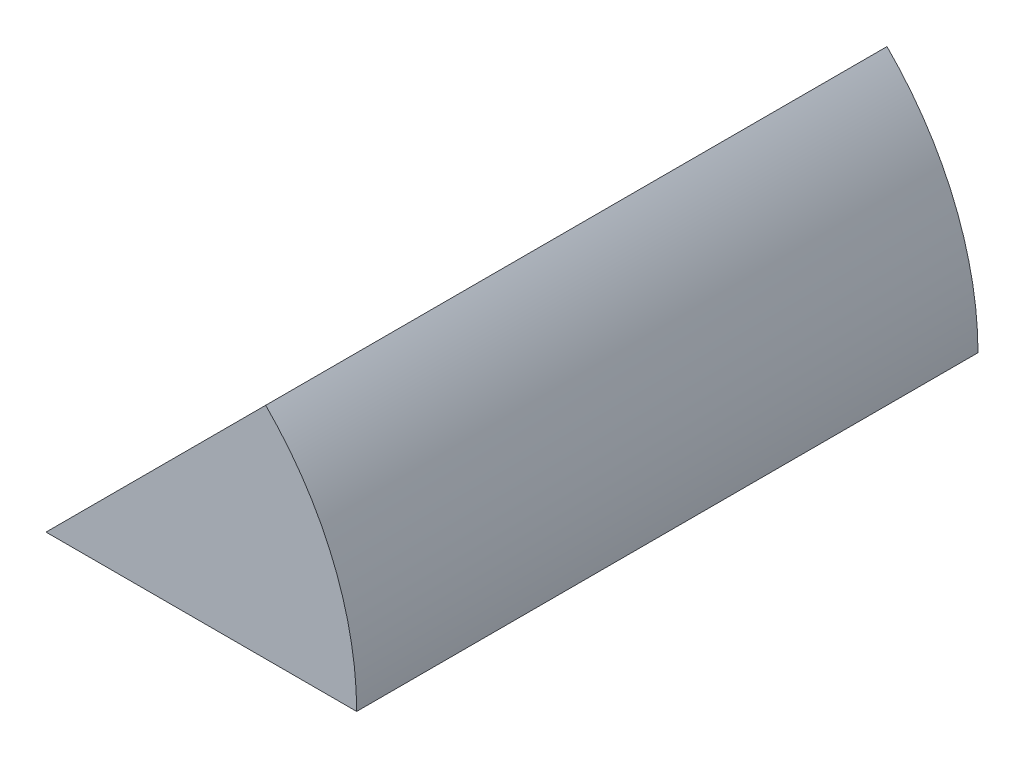
ISO-10303-21;
HEADER;
FILE_DESCRIPTION(('STEP AP214'),'2;1');
FILE_NAME('part.step','',(''),(''),'','','');
FILE_SCHEMA(('AUTOMOTIVE_DESIGN { 1 0 10303 214 1 1 1 1 }'));
ENDSEC;
DATA;
#1=APPLICATION_CONTEXT('core data for automotive mechanical design processes');
#2=APPLICATION_PROTOCOL_DEFINITION('international standard','automotive_design',2000,#1);
#3=PRODUCT_CONTEXT('',#1,'mechanical');
#4=PRODUCT('Part','Part','',(#3));
#5=PRODUCT_RELATED_PRODUCT_CATEGORY('part','',(#4));
#6=PRODUCT_DEFINITION_FORMATION('','',#4);
#7=PRODUCT_DEFINITION_CONTEXT('part definition',#1,'design');
#8=PRODUCT_DEFINITION('design','',#6,#7);
#9=PRODUCT_DEFINITION_SHAPE('','',#8);
#10=(LENGTH_UNIT() NAMED_UNIT(*) SI_UNIT(.MILLI.,.METRE.));
#11=(NAMED_UNIT(*) PLANE_ANGLE_UNIT() SI_UNIT($,.RADIAN.));
#12=(NAMED_UNIT(*) SI_UNIT($,.STERADIAN.) SOLID_ANGLE_UNIT());
#13=UNCERTAINTY_MEASURE_WITH_UNIT(LENGTH_MEASURE(1.E-05),#10,'distance_accuracy_value','');
#14=(GEOMETRIC_REPRESENTATION_CONTEXT(3) GLOBAL_UNCERTAINTY_ASSIGNED_CONTEXT((#13)) GLOBAL_UNIT_ASSIGNED_CONTEXT((#10,
#11,#12)) REPRESENTATION_CONTEXT('',''));
#15=CARTESIAN_POINT('',(0.,0.,0.));
#16=DIRECTION('',(0.,0.,1.));
#17=DIRECTION('',(1.,0.,0.));
#18=AXIS2_PLACEMENT_3D('',#15,#16,#17);
#19=CARTESIAN_POINT('',(0.,0.,50.));
#20=DIRECTION('',(0.707106781186549,-0.707106781186546,0.));
#21=DIRECTION('',(0.707106781186546,0.707106781186549,0.));
#22=AXIS2_PLACEMENT_3D('',#19,#20,#21);
#23=PLANE('',#22);
#24=DIRECTION('',(-0.707106781186546,-0.707106781186549,0.));
#25=VECTOR('',#24,1.);
#26=CARTESIAN_POINT('',(0.,0.,0.));
#27=LINE('',#26,#25);
#28=CARTESIAN_POINT('',(17.6776695296637,17.6776695296637,0.));
#29=VERTEX_POINT('',#28);
#30=CARTESIAN_POINT('',(0.,0.,0.));
#31=VERTEX_POINT('',#30);
#32=EDGE_CURVE('E80',#29,#31,#27,.T.);
#33=ORIENTED_EDGE('',*,*,#32,.T.);
#34=DIRECTION('',(0.,0.,-1.));
#35=VECTOR('',#34,1.);
#36=CARTESIAN_POINT('',(0.,0.,50.));
#37=LINE('',#36,#35);
#38=CARTESIAN_POINT('',(0.,0.,50.));
#39=VERTEX_POINT('',#38);
#40=EDGE_CURVE('E11',#39,#31,#37,.T.);
#41=ORIENTED_EDGE('',*,*,#40,.F.);
#42=DIRECTION('',(-0.707106781186546,-0.707106781186549,0.));
#43=VECTOR('',#42,1.);
#44=CARTESIAN_POINT('',(0.,0.,50.));
#45=LINE('',#44,#43);
#46=CARTESIAN_POINT('',(17.6776695296637,17.6776695296637,50.));
#47=VERTEX_POINT('',#46);
#48=EDGE_CURVE('E73',#47,#39,#45,.T.);
#49=ORIENTED_EDGE('',*,*,#48,.F.);
#50=DIRECTION('',(0.,0.,-1.));
#51=VECTOR('',#50,1.);
#52=CARTESIAN_POINT('',(17.6776695296637,17.6776695296637,50.));
#53=LINE('',#52,#51);
#54=EDGE_CURVE('E81',#47,#29,#53,.T.);
#55=ORIENTED_EDGE('',*,*,#54,.T.);
#56=EDGE_LOOP('',(#33,#41,#49,#55));
#57=FACE_BOUND('',#56,.T.);
#58=ADVANCED_FACE('F33',(#57),#23,.F.);
#59=CARTESIAN_POINT('',(0.,0.,50.));
#60=DIRECTION('',(0.,1.,0.));
#61=DIRECTION('',(0.,0.,1.));
#62=AXIS2_PLACEMENT_3D('',#59,#60,#61);
#63=PLANE('',#62);
#64=DIRECTION('',(1.,0.,0.));
#65=VECTOR('',#64,1.);
#66=CARTESIAN_POINT('',(0.,0.,0.));
#67=LINE('',#66,#65);
#68=CARTESIAN_POINT('',(25.,0.,0.));
#69=VERTEX_POINT('',#68);
#70=EDGE_CURVE('E61',#31,#69,#67,.T.);
#71=ORIENTED_EDGE('',*,*,#70,.T.);
#72=DIRECTION('',(0.,0.,-1.));
#73=VECTOR('',#72,1.);
#74=CARTESIAN_POINT('',(25.,0.,50.));
#75=LINE('',#74,#73);
#76=CARTESIAN_POINT('',(25.,0.,50.));
#77=VERTEX_POINT('',#76);
#78=EDGE_CURVE('E41',#77,#69,#75,.T.);
#79=ORIENTED_EDGE('',*,*,#78,.F.);
#80=DIRECTION('',(1.,0.,0.));
#81=VECTOR('',#80,1.);
#82=CARTESIAN_POINT('',(0.,0.,50.));
#83=LINE('',#82,#81);
#84=EDGE_CURVE('E69',#39,#77,#83,.T.);
#85=ORIENTED_EDGE('',*,*,#84,.F.);
#86=ORIENTED_EDGE('',*,*,#40,.T.);
#87=EDGE_LOOP('',(#71,#79,#85,#86));
#88=FACE_BOUND('',#87,.T.);
#89=ADVANCED_FACE('F70',(#88),#63,.F.);
#90=CARTESIAN_POINT('',(0.,0.,50.));
#91=DIRECTION('',(0.,0.,-1.));
#92=DIRECTION('',(-1.,0.,0.));
#93=AXIS2_PLACEMENT_3D('',#90,#91,#92);
#94=CYLINDRICAL_SURFACE('',#93,25.);
#95=CARTESIAN_POINT('',(0.,0.,0.));
#96=DIRECTION('',(0.,0.,1.));
#97=DIRECTION('',(1.,0.,0.));
#98=AXIS2_PLACEMENT_3D('',#95,#96,#97);
#99=CIRCLE('',#98,25.);
#100=EDGE_CURVE('E66',#69,#29,#99,.T.);
#101=ORIENTED_EDGE('',*,*,#100,.T.);
#102=ORIENTED_EDGE('',*,*,#54,.F.);
#103=CARTESIAN_POINT('',(0.,0.,50.));
#104=DIRECTION('',(0.,0.,1.));
#105=DIRECTION('',(1.,0.,0.));
#106=AXIS2_PLACEMENT_3D('',#103,#104,#105);
#107=CIRCLE('',#106,25.);
#108=EDGE_CURVE('E49',#77,#47,#107,.T.);
#109=ORIENTED_EDGE('',*,*,#108,.F.);
#110=ORIENTED_EDGE('',*,*,#78,.T.);
#111=EDGE_LOOP('',(#101,#102,#109,#110));
#112=FACE_BOUND('',#111,.T.);
#113=ADVANCED_FACE('F92',(#112),#94,.T.);
#114=CARTESIAN_POINT('',(0.,0.,50.));
#115=DIRECTION('',(0.,0.,1.));
#116=DIRECTION('',(1.,0.,0.));
#117=AXIS2_PLACEMENT_3D('',#114,#115,#116);
#118=PLANE('',#117);
#119=ORIENTED_EDGE('',*,*,#48,.T.);
#120=ORIENTED_EDGE('',*,*,#84,.T.);
#121=ORIENTED_EDGE('',*,*,#108,.T.);
#122=EDGE_LOOP('',(#119,#120,#121));
#123=FACE_BOUND('',#122,.T.);
#124=ADVANCED_FACE('F76',(#123),#118,.T.);
#125=CARTESIAN_POINT('',(0.,0.,0.));
#126=DIRECTION('',(0.,0.,1.));
#127=DIRECTION('',(1.,0.,0.));
#128=AXIS2_PLACEMENT_3D('',#125,#126,#127);
#129=PLANE('',#128);
#130=CARTESIAN_POINT('',(16.6723398887001,6.67407209315485,0.));
#131=DIRECTION('',(0.,0.,-1.));
#132=DIRECTION('',(-1.,0.,0.));
#133=AXIS2_PLACEMENT_3D('',#130,#131,#132);
#134=CIRCLE('',#133,5.);
#135=CARTESIAN_POINT('',(11.6723398887001,6.67407209315485,0.));
#136=VERTEX_POINT('',#135);
#137=EDGE_CURVE('E87',#136,#136,#134,.T.);
#138=ORIENTED_EDGE('',*,*,#137,.F.);
#139=EDGE_LOOP('',(#138));
#140=FACE_BOUND('',#139,.T.);
#141=ORIENTED_EDGE('',*,*,#32,.F.);
#142=ORIENTED_EDGE('',*,*,#100,.F.);
#143=ORIENTED_EDGE('',*,*,#70,.F.);
#144=EDGE_LOOP('',(#141,#142,#143));
#145=FACE_BOUND('',#144,.T.);
#146=ADVANCED_FACE('F93',(#140,#145),#129,.F.);
#147=CARTESIAN_POINT('',(16.6723398887001,6.67407209315485,10.));
#148=DIRECTION('',(0.,0.,-1.));
#149=DIRECTION('',(-1.,0.,0.));
#150=AXIS2_PLACEMENT_3D('',#147,#148,#149);
#151=CYLINDRICAL_SURFACE('',#150,5.);
#152=CARTESIAN_POINT('',(16.6723398887001,6.67407209315485,10.));
#153=DIRECTION('',(0.,0.,-1.));
#154=DIRECTION('',(-1.,0.,0.));
#155=AXIS2_PLACEMENT_3D('',#152,#153,#154);
#156=CIRCLE('',#155,5.);
#157=CARTESIAN_POINT('',(11.6723398887001,6.67407209315485,10.));
#158=VERTEX_POINT('',#157);
#159=EDGE_CURVE('E83',#158,#158,#156,.T.);
#160=ORIENTED_EDGE('',*,*,#159,.F.);
#161=EDGE_LOOP('',(#160));
#162=FACE_BOUND('',#161,.T.);
#163=ORIENTED_EDGE('',*,*,#137,.T.);
#164=EDGE_LOOP('',(#163));
#165=FACE_BOUND('',#164,.T.);
#166=ADVANCED_FACE('F95',(#162,#165),#151,.F.);
#167=CARTESIAN_POINT('',(16.6723398887001,6.67407209315485,10.));
#168=DIRECTION('',(0.,0.,-1.));
#169=DIRECTION('',(-1.,0.,0.));
#170=AXIS2_PLACEMENT_3D('',#167,#168,#169);
#171=PLANE('',#170);
#172=ORIENTED_EDGE('',*,*,#159,.T.);
#173=EDGE_LOOP('',(#172));
#174=FACE_BOUND('',#173,.T.);
#175=ADVANCED_FACE('F102',(#174),#171,.T.);
#176=CLOSED_SHELL('',(#58,#89,#113,#124,#146,#166,#175));
#177=MANIFOLD_SOLID_BREP('B2',#176);
#178=ADVANCED_BREP_SHAPE_REPRESENTATION('',(#18,#177),#14);
#179=SHAPE_DEFINITION_REPRESENTATION(#9,#178);
ENDSEC;
END-ISO-10303-21;
